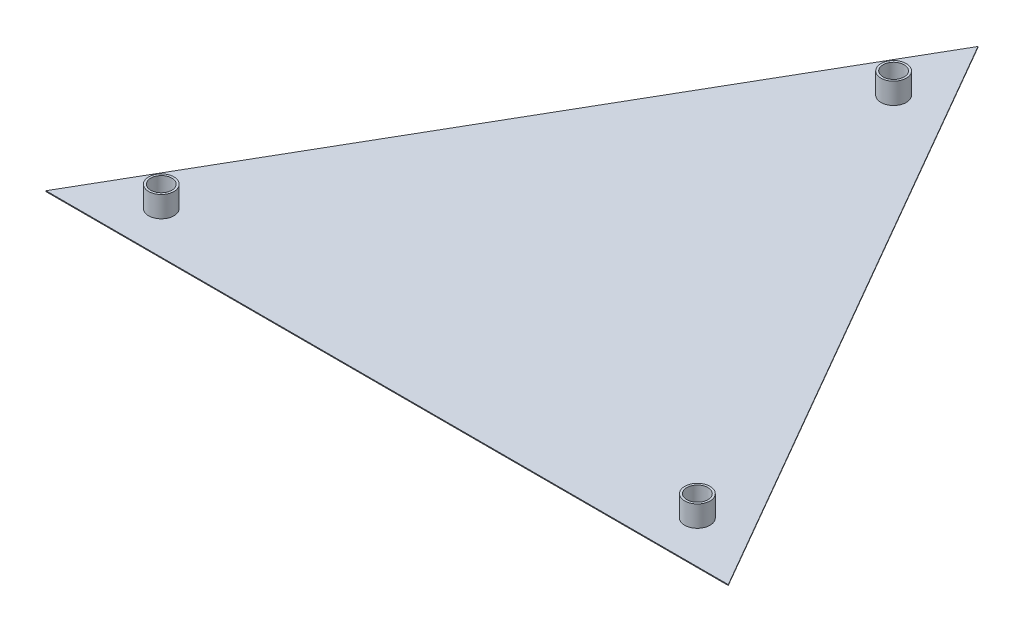
ISO-10303-21;
HEADER;
FILE_DESCRIPTION(('STEP AP214'),'2;1');
FILE_NAME('part.step','',(''),(''),'','','');
FILE_SCHEMA(('AUTOMOTIVE_DESIGN { 1 0 10303 214 1 1 1 1 }'));
ENDSEC;
DATA;
#1=APPLICATION_CONTEXT('core data for automotive mechanical design processes');
#2=APPLICATION_PROTOCOL_DEFINITION('international standard','automotive_design',2000,#1);
#3=PRODUCT_CONTEXT('',#1,'mechanical');
#4=PRODUCT('Part','Part','',(#3));
#5=PRODUCT_RELATED_PRODUCT_CATEGORY('part','',(#4));
#6=PRODUCT_DEFINITION_FORMATION('','',#4);
#7=PRODUCT_DEFINITION_CONTEXT('part definition',#1,'design');
#8=PRODUCT_DEFINITION('design','',#6,#7);
#9=PRODUCT_DEFINITION_SHAPE('','',#8);
#10=(LENGTH_UNIT() NAMED_UNIT(*) SI_UNIT(.MILLI.,.METRE.));
#11=(NAMED_UNIT(*) PLANE_ANGLE_UNIT() SI_UNIT($,.RADIAN.));
#12=(NAMED_UNIT(*) SI_UNIT($,.STERADIAN.) SOLID_ANGLE_UNIT());
#13=UNCERTAINTY_MEASURE_WITH_UNIT(LENGTH_MEASURE(1.E-05),#10,'distance_accuracy_value','');
#14=(GEOMETRIC_REPRESENTATION_CONTEXT(3) GLOBAL_UNCERTAINTY_ASSIGNED_CONTEXT((#13)) GLOBAL_UNIT_ASSIGNED_CONTEXT((#10,
#11,#12)) REPRESENTATION_CONTEXT('',''));
#15=CARTESIAN_POINT('',(0.,0.,0.));
#16=DIRECTION('',(0.,0.,1.));
#17=DIRECTION('',(1.,0.,0.));
#18=AXIS2_PLACEMENT_3D('',#15,#16,#17);
#19=CARTESIAN_POINT('',(347.27360972876,5.,-3.60923082455256));
#20=DIRECTION('',(0.,1.,0.));
#21=DIRECTION('',(0.,0.,1.));
#22=AXIS2_PLACEMENT_3D('',#19,#20,#21);
#23=PLANE('',#22);
#24=CARTESIAN_POINT('',(347.27360972876,5.,-3.60923082455256));
#25=DIRECTION('',(0.,1.,0.));
#26=DIRECTION('',(0.,0.,1.));
#27=AXIS2_PLACEMENT_3D('',#24,#25,#26);
#28=CIRCLE('',#27,2.99999999999999);
#29=CARTESIAN_POINT('',(347.27360972876,5.,-0.609230824552565));
#30=VERTEX_POINT('',#29);
#31=EDGE_CURVE('E66',#30,#30,#28,.T.);
#32=ORIENTED_EDGE('',*,*,#31,.T.);
#33=EDGE_LOOP('',(#32));
#34=FACE_BOUND('',#33,.T.);
#35=CARTESIAN_POINT('',(347.27360972876,5.,-3.60923082455256));
#36=DIRECTION('',(0.,1.,0.));
#37=DIRECTION('',(0.,0.,1.));
#38=AXIS2_PLACEMENT_3D('',#35,#36,#37);
#39=CIRCLE('',#38,2.50000000000002);
#40=CARTESIAN_POINT('',(347.27360972876,5.,-1.10923082455254));
#41=VERTEX_POINT('',#40);
#42=EDGE_CURVE('E57',#41,#41,#39,.T.);
#43=ORIENTED_EDGE('',*,*,#42,.F.);
#44=EDGE_LOOP('',(#43));
#45=FACE_BOUND('',#44,.T.);
#46=ADVANCED_FACE('F53',(#34,#45),#23,.T.);
#47=CARTESIAN_POINT('',(347.27360972876,0.,-3.60923082455256));
#48=DIRECTION('',(0.,1.,0.));
#49=DIRECTION('',(0.,0.,1.));
#50=AXIS2_PLACEMENT_3D('',#47,#48,#49);
#51=PLANE('',#50);
#52=CARTESIAN_POINT('',(347.27360972876,0.,-3.60923082455256));
#53=DIRECTION('',(0.,1.,0.));
#54=DIRECTION('',(0.,0.,1.));
#55=AXIS2_PLACEMENT_3D('',#52,#53,#54);
#56=CIRCLE('',#55,2.99999999999999);
#57=CARTESIAN_POINT('',(347.27360972876,0.,-0.609230824552565));
#58=VERTEX_POINT('',#57);
#59=EDGE_CURVE('E64',#58,#58,#56,.T.);
#60=ORIENTED_EDGE('',*,*,#59,.F.);
#61=EDGE_LOOP('',(#60));
#62=FACE_BOUND('',#61,.T.);
#63=CARTESIAN_POINT('',(347.27360972876,0.,-3.60923082455256));
#64=DIRECTION('',(0.,1.,0.));
#65=DIRECTION('',(0.,0.,1.));
#66=AXIS2_PLACEMENT_3D('',#63,#64,#65);
#67=CIRCLE('',#66,2.50000000000002);
#68=CARTESIAN_POINT('',(347.27360972876,0.,-1.10923082455254));
#69=VERTEX_POINT('',#68);
#70=EDGE_CURVE('E12',#69,#69,#67,.T.);
#71=ORIENTED_EDGE('',*,*,#70,.T.);
#72=EDGE_LOOP('',(#71));
#73=FACE_BOUND('',#72,.T.);
#74=ADVANCED_FACE('F74',(#62,#73),#51,.F.);
#75=CARTESIAN_POINT('',(347.27360972876,5.,-3.60923082455256));
#76=DIRECTION('',(0.,-1.,0.));
#77=DIRECTION('',(0.,0.,-1.));
#78=AXIS2_PLACEMENT_3D('',#75,#76,#77);
#79=CYLINDRICAL_SURFACE('',#78,2.99999999999999);
#80=ORIENTED_EDGE('',*,*,#31,.F.);
#81=EDGE_LOOP('',(#80));
#82=FACE_BOUND('',#81,.T.);
#83=ORIENTED_EDGE('',*,*,#59,.T.);
#84=EDGE_LOOP('',(#83));
#85=FACE_BOUND('',#84,.T.);
#86=ADVANCED_FACE('F72',(#82,#85),#79,.T.);
#87=CARTESIAN_POINT('',(347.27360972876,5.,-3.60923082455256));
#88=DIRECTION('',(0.,-1.,0.));
#89=DIRECTION('',(0.,0.,-1.));
#90=AXIS2_PLACEMENT_3D('',#87,#88,#89);
#91=CYLINDRICAL_SURFACE('',#90,2.50000000000002);
#92=ORIENTED_EDGE('',*,*,#42,.T.);
#93=EDGE_LOOP('',(#92));
#94=FACE_BOUND('',#93,.T.);
#95=ORIENTED_EDGE('',*,*,#70,.F.);
#96=EDGE_LOOP('',(#95));
#97=FACE_BOUND('',#96,.T.);
#98=ADVANCED_FACE('F55',(#94,#97),#91,.F.);
#99=CLOSED_SHELL('',(#46,#74,#86,#98));
#100=MANIFOLD_SOLID_BREP('B2',#99);
#101=CARTESIAN_POINT('',(410.793152562545,5.,106.417182486529));
#102=DIRECTION('',(0.,1.,0.));
#103=DIRECTION('',(0.,0.,1.));
#104=AXIS2_PLACEMENT_3D('',#101,#102,#103);
#105=PLANE('',#104);
#106=CARTESIAN_POINT('',(410.793152562545,5.,106.417182486529));
#107=DIRECTION('',(0.,1.,0.));
#108=DIRECTION('',(0.,0.,1.));
#109=AXIS2_PLACEMENT_3D('',#106,#107,#108);
#110=CIRCLE('',#109,2.99999999999999);
#111=CARTESIAN_POINT('',(410.793152562545,5.,109.417182486529));
#112=VERTEX_POINT('',#111);
#113=EDGE_CURVE('E135',#112,#112,#110,.T.);
#114=ORIENTED_EDGE('',*,*,#113,.T.);
#115=EDGE_LOOP('',(#114));
#116=FACE_BOUND('',#115,.T.);
#117=CARTESIAN_POINT('',(410.793152562545,5.,106.417182486529));
#118=DIRECTION('',(0.,1.,0.));
#119=DIRECTION('',(0.,0.,1.));
#120=AXIS2_PLACEMENT_3D('',#117,#118,#119);
#121=CIRCLE('',#120,2.50000000000002);
#122=CARTESIAN_POINT('',(410.793152562545,5.,108.917182486529));
#123=VERTEX_POINT('',#122);
#124=EDGE_CURVE('E126',#123,#123,#121,.T.);
#125=ORIENTED_EDGE('',*,*,#124,.F.);
#126=EDGE_LOOP('',(#125));
#127=FACE_BOUND('',#126,.T.);
#128=ADVANCED_FACE('F122',(#116,#127),#105,.T.);
#129=CARTESIAN_POINT('',(410.793152562545,0.,106.417182486529));
#130=DIRECTION('',(0.,1.,0.));
#131=DIRECTION('',(0.,0.,1.));
#132=AXIS2_PLACEMENT_3D('',#129,#130,#131);
#133=PLANE('',#132);
#134=CARTESIAN_POINT('',(410.793152562545,0.,106.417182486529));
#135=DIRECTION('',(0.,1.,0.));
#136=DIRECTION('',(0.,0.,1.));
#137=AXIS2_PLACEMENT_3D('',#134,#135,#136);
#138=CIRCLE('',#137,2.99999999999999);
#139=CARTESIAN_POINT('',(410.793152562545,0.,109.417182486529));
#140=VERTEX_POINT('',#139);
#141=EDGE_CURVE('E133',#140,#140,#138,.T.);
#142=ORIENTED_EDGE('',*,*,#141,.F.);
#143=EDGE_LOOP('',(#142));
#144=FACE_BOUND('',#143,.T.);
#145=CARTESIAN_POINT('',(410.793152562545,0.,106.417182486529));
#146=DIRECTION('',(0.,1.,0.));
#147=DIRECTION('',(0.,0.,1.));
#148=AXIS2_PLACEMENT_3D('',#145,#146,#147);
#149=CIRCLE('',#148,2.50000000000002);
#150=CARTESIAN_POINT('',(410.793152562545,0.,108.917182486529));
#151=VERTEX_POINT('',#150);
#152=EDGE_CURVE('E52',#151,#151,#149,.T.);
#153=ORIENTED_EDGE('',*,*,#152,.T.);
#154=EDGE_LOOP('',(#153));
#155=FACE_BOUND('',#154,.T.);
#156=ADVANCED_FACE('F143',(#144,#155),#133,.F.);
#157=CARTESIAN_POINT('',(410.793152562545,5.,106.417182486529));
#158=DIRECTION('',(0.,-1.,0.));
#159=DIRECTION('',(0.,0.,-1.));
#160=AXIS2_PLACEMENT_3D('',#157,#158,#159);
#161=CYLINDRICAL_SURFACE('',#160,2.99999999999999);
#162=ORIENTED_EDGE('',*,*,#113,.F.);
#163=EDGE_LOOP('',(#162));
#164=FACE_BOUND('',#163,.T.);
#165=ORIENTED_EDGE('',*,*,#141,.T.);
#166=EDGE_LOOP('',(#165));
#167=FACE_BOUND('',#166,.T.);
#168=ADVANCED_FACE('F141',(#164,#167),#161,.T.);
#169=CARTESIAN_POINT('',(410.793152562545,5.,106.417182486529));
#170=DIRECTION('',(0.,-1.,0.));
#171=DIRECTION('',(0.,0.,-1.));
#172=AXIS2_PLACEMENT_3D('',#169,#170,#171);
#173=CYLINDRICAL_SURFACE('',#172,2.50000000000002);
#174=ORIENTED_EDGE('',*,*,#124,.T.);
#175=EDGE_LOOP('',(#174));
#176=FACE_BOUND('',#175,.T.);
#177=ORIENTED_EDGE('',*,*,#152,.F.);
#178=EDGE_LOOP('',(#177));
#179=FACE_BOUND('',#178,.T.);
#180=ADVANCED_FACE('F124',(#176,#179),#173,.F.);
#181=CLOSED_SHELL('',(#128,#156,#168,#180));
#182=MANIFOLD_SOLID_BREP('B7',#181);
#183=CARTESIAN_POINT('',(283.758521159064,5.,106.426112565137));
#184=DIRECTION('',(0.,-1.,0.));
#185=DIRECTION('',(0.,0.,-1.));
#186=AXIS2_PLACEMENT_3D('',#183,#184,#185);
#187=CYLINDRICAL_SURFACE('',#186,2.50000000000002);
#188=CARTESIAN_POINT('',(283.758521159064,5.,106.426112565137));
#189=DIRECTION('',(0.,1.,0.));
#190=DIRECTION('',(0.,0.,1.));
#191=AXIS2_PLACEMENT_3D('',#188,#189,#190);
#192=CIRCLE('',#191,2.50000000000002);
#193=CARTESIAN_POINT('',(283.758521159064,5.,108.926112565137));
#194=VERTEX_POINT('',#193);
#195=EDGE_CURVE('E199',#194,#194,#192,.T.);
#196=ORIENTED_EDGE('',*,*,#195,.T.);
#197=EDGE_LOOP('',(#196));
#198=FACE_BOUND('',#197,.T.);
#199=CARTESIAN_POINT('',(283.758521159064,0.,106.426112565137));
#200=DIRECTION('',(0.,1.,0.));
#201=DIRECTION('',(0.,0.,1.));
#202=AXIS2_PLACEMENT_3D('',#199,#200,#201);
#203=CIRCLE('',#202,2.50000000000002);
#204=CARTESIAN_POINT('',(283.758521159064,0.,108.926112565137));
#205=VERTEX_POINT('',#204);
#206=EDGE_CURVE('E205',#205,#205,#203,.T.);
#207=ORIENTED_EDGE('',*,*,#206,.F.);
#208=EDGE_LOOP('',(#207));
#209=FACE_BOUND('',#208,.T.);
#210=ADVANCED_FACE('F192',(#198,#209),#187,.F.);
#211=CARTESIAN_POINT('',(283.758521159064,5.,106.426112565137));
#212=DIRECTION('',(0.,-1.,0.));
#213=DIRECTION('',(0.,0.,-1.));
#214=AXIS2_PLACEMENT_3D('',#211,#212,#213);
#215=CYLINDRICAL_SURFACE('',#214,2.99999999999999);
#216=CARTESIAN_POINT('',(283.758521159064,5.,106.426112565137));
#217=DIRECTION('',(0.,1.,0.));
#218=DIRECTION('',(0.,0.,1.));
#219=AXIS2_PLACEMENT_3D('',#216,#217,#218);
#220=CIRCLE('',#219,2.99999999999999);
#221=CARTESIAN_POINT('',(283.758521159064,5.,109.426112565137));
#222=VERTEX_POINT('',#221);
#223=EDGE_CURVE('E121',#222,#222,#220,.T.);
#224=ORIENTED_EDGE('',*,*,#223,.F.);
#225=EDGE_LOOP('',(#224));
#226=FACE_BOUND('',#225,.T.);
#227=CARTESIAN_POINT('',(283.758521159064,0.,106.426112565137));
#228=DIRECTION('',(0.,1.,0.));
#229=DIRECTION('',(0.,0.,1.));
#230=AXIS2_PLACEMENT_3D('',#227,#228,#229);
#231=CIRCLE('',#230,2.99999999999999);
#232=CARTESIAN_POINT('',(283.758521159064,0.,109.426112565137));
#233=VERTEX_POINT('',#232);
#234=EDGE_CURVE('E195',#233,#233,#231,.T.);
#235=ORIENTED_EDGE('',*,*,#234,.T.);
#236=EDGE_LOOP('',(#235));
#237=FACE_BOUND('',#236,.T.);
#238=ADVANCED_FACE('F212',(#226,#237),#215,.T.);
#239=CARTESIAN_POINT('',(0.,5.,0.));
#240=DIRECTION('',(0.,1.,0.));
#241=DIRECTION('',(0.,0.,1.));
#242=AXIS2_PLACEMENT_3D('',#239,#240,#241);
#243=PLANE('',#242);
#244=ORIENTED_EDGE('',*,*,#195,.F.);
#245=EDGE_LOOP('',(#244));
#246=FACE_BOUND('',#245,.T.);
#247=ORIENTED_EDGE('',*,*,#223,.T.);
#248=EDGE_LOOP('',(#247));
#249=FACE_BOUND('',#248,.T.);
#250=ADVANCED_FACE('F216',(#246,#249),#243,.T.);
#251=CARTESIAN_POINT('',(0.,0.,0.));
#252=DIRECTION('',(0.,1.,0.));
#253=DIRECTION('',(0.,0.,1.));
#254=AXIS2_PLACEMENT_3D('',#251,#252,#253);
#255=PLANE('',#254);
#256=ORIENTED_EDGE('',*,*,#206,.T.);
#257=EDGE_LOOP('',(#256));
#258=FACE_BOUND('',#257,.T.);
#259=ORIENTED_EDGE('',*,*,#234,.F.);
#260=EDGE_LOOP('',(#259));
#261=FACE_BOUND('',#260,.T.);
#262=ADVANCED_FACE('F214',(#258,#261),#255,.F.);
#263=CLOSED_SHELL('',(#210,#238,#250,#262));
#264=MANIFOLD_SOLID_BREP('B47',#263);
#265=CARTESIAN_POINT('',(250.258955329302,-0.2,144.458416065656));
#266=DIRECTION('',(0.866068346977982,0.,0.499925612829375));
#267=DIRECTION('',(0.499925612829375,0.,-0.866068346977982));
#268=AXIS2_PLACEMENT_3D('',#265,#266,#267);
#269=PLANE('',#268);
#270=DIRECTION('',(0.499925612829375,0.,-0.866068346977982));
#271=VECTOR('',#270,1.);
#272=CARTESIAN_POINT('',(250.258955329302,0.,144.458416065656));
#273=LINE('',#272,#271);
#274=CARTESIAN_POINT('',(266.439108268201,0.,116.42800924106));
#275=VERTEX_POINT('',#274);
#276=CARTESIAN_POINT('',(347.27360972876,0.,-23.6092308245526));
#277=VERTEX_POINT('',#276);
#278=EDGE_CURVE('E317',#275,#277,#273,.T.);
#279=ORIENTED_EDGE('',*,*,#278,.T.);
#280=DIRECTION('',(0.,1.,0.));
#281=VECTOR('',#280,1.);
#282=CARTESIAN_POINT('',(347.27360972876,-0.2,-23.6092308245526));
#283=LINE('',#282,#281);
#284=CARTESIAN_POINT('',(347.27360972876,-0.2,-23.6092308245526));
#285=VERTEX_POINT('',#284);
#286=EDGE_CURVE('E190',#285,#277,#283,.T.);
#287=ORIENTED_EDGE('',*,*,#286,.F.);
#288=DIRECTION('',(0.499925612829375,0.,-0.866068346977982));
#289=VECTOR('',#288,1.);
#290=CARTESIAN_POINT('',(250.258955329302,-0.2,144.458416065656));
#291=LINE('',#290,#289);
#292=CARTESIAN_POINT('',(266.439108268201,-0.2,116.42800924106));
#293=VERTEX_POINT('',#292);
#294=EDGE_CURVE('E299',#293,#285,#291,.T.);
#295=ORIENTED_EDGE('',*,*,#294,.F.);
#296=DIRECTION('',(0.,1.,0.));
#297=VECTOR('',#296,1.);
#298=CARTESIAN_POINT('',(266.439108268201,-0.2,116.42800924106));
#299=LINE('',#298,#297);
#300=EDGE_CURVE('E257',#293,#275,#299,.T.);
#301=ORIENTED_EDGE('',*,*,#300,.T.);
#302=EDGE_LOOP('',(#279,#287,#295,#301));
#303=FACE_BOUND('',#302,.T.);
#304=ADVANCED_FACE('F253',(#303),#269,.F.);
#305=CARTESIAN_POINT('',(270.684828790068,-0.2,-156.271808922297));
#306=DIRECTION('',(-0.866036694302782,0.,0.499980443738663));
#307=DIRECTION('',(0.499980443738663,0.,0.866036694302782));
#308=AXIS2_PLACEMENT_3D('',#305,#306,#307);
#309=PLANE('',#308);
#310=DIRECTION('',(0.499980443738663,0.,0.866036694302782));
#311=VECTOR('',#310,1.);
#312=CARTESIAN_POINT('',(270.684828790068,0.,-156.271808922297));
#313=LINE('',#312,#311);
#314=CARTESIAN_POINT('',(428.113670918371,0.,116.417164680787));
#315=VERTEX_POINT('',#314);
#316=EDGE_CURVE('E289',#277,#315,#313,.T.);
#317=ORIENTED_EDGE('',*,*,#316,.T.);
#318=DIRECTION('',(0.,1.,0.));
#319=VECTOR('',#318,1.);
#320=CARTESIAN_POINT('',(428.113670918371,-0.2,116.417164680787));
#321=LINE('',#320,#319);
#322=CARTESIAN_POINT('',(428.113670918371,-0.2,116.417164680787));
#323=VERTEX_POINT('',#322);
#324=EDGE_CURVE('E263',#323,#315,#321,.T.);
#325=ORIENTED_EDGE('',*,*,#324,.F.);
#326=DIRECTION('',(0.499980443738663,0.,0.866036694302782));
#327=VECTOR('',#326,1.);
#328=CARTESIAN_POINT('',(270.684828790068,-0.2,-156.271808922297));
#329=LINE('',#328,#327);
#330=EDGE_CURVE('E271',#285,#323,#329,.T.);
#331=ORIENTED_EDGE('',*,*,#330,.F.);
#332=ORIENTED_EDGE('',*,*,#286,.T.);
#333=EDGE_LOOP('',(#317,#325,#331,#332));
#334=FACE_BOUND('',#333,.T.);
#335=ADVANCED_FACE('F336',(#334),#309,.F.);
#336=CARTESIAN_POINT('',(347.27360972876,-0.2,-3.60923082455256));
#337=DIRECTION('',(0.,1.,0.));
#338=DIRECTION('',(0.,0.,1.));
#339=AXIS2_PLACEMENT_3D('',#336,#337,#338);
#340=CYLINDRICAL_SURFACE('',#339,2.99999999999999);
#341=CARTESIAN_POINT('',(347.27360972876,-0.2,-3.60923082455256));
#342=DIRECTION('',(0.,1.,0.));
#343=DIRECTION('',(0.,0.,1.));
#344=AXIS2_PLACEMENT_3D('',#341,#342,#343);
#345=CIRCLE('',#344,2.99999999999999);
#346=CARTESIAN_POINT('',(347.27360972876,-0.2,-0.609230824552565));
#347=VERTEX_POINT('',#346);
#348=EDGE_CURVE('E301',#347,#347,#345,.T.);
#349=ORIENTED_EDGE('',*,*,#348,.F.);
#350=EDGE_LOOP('',(#349));
#351=FACE_BOUND('',#350,.T.);
#352=CARTESIAN_POINT('',(347.27360972876,0.,-3.60923082455256));
#353=DIRECTION('',(0.,1.,0.));
#354=DIRECTION('',(0.,0.,1.));
#355=AXIS2_PLACEMENT_3D('',#352,#353,#354);
#356=CIRCLE('',#355,2.99999999999999);
#357=CARTESIAN_POINT('',(347.27360972876,0.,-0.609230824552565));
#358=VERTEX_POINT('',#357);
#359=EDGE_CURVE('E314',#358,#358,#356,.T.);
#360=ORIENTED_EDGE('',*,*,#359,.T.);
#361=EDGE_LOOP('',(#360));
#362=FACE_BOUND('',#361,.T.);
#363=ADVANCED_FACE('F332',(#351,#362),#340,.F.);
#364=CARTESIAN_POINT('',(410.793152562545,-0.2,106.417182486529));
#365=DIRECTION('',(0.,1.,0.));
#366=DIRECTION('',(0.,0.,1.));
#367=AXIS2_PLACEMENT_3D('',#364,#365,#366);
#368=CYLINDRICAL_SURFACE('',#367,2.99999999999999);
#369=CARTESIAN_POINT('',(410.793152562545,-0.2,106.417182486529));
#370=DIRECTION('',(0.,1.,0.));
#371=DIRECTION('',(0.,0.,1.));
#372=AXIS2_PLACEMENT_3D('',#369,#370,#371);
#373=CIRCLE('',#372,2.99999999999999);
#374=CARTESIAN_POINT('',(410.793152562545,-0.2,109.417182486529));
#375=VERTEX_POINT('',#374);
#376=EDGE_CURVE('E322',#375,#375,#373,.T.);
#377=ORIENTED_EDGE('',*,*,#376,.F.);
#378=EDGE_LOOP('',(#377));
#379=FACE_BOUND('',#378,.T.);
#380=CARTESIAN_POINT('',(410.793152562545,0.,106.417182486529));
#381=DIRECTION('',(0.,1.,0.));
#382=DIRECTION('',(0.,0.,1.));
#383=AXIS2_PLACEMENT_3D('',#380,#381,#382);
#384=CIRCLE('',#383,2.99999999999999);
#385=CARTESIAN_POINT('',(410.793152562545,0.,109.417182486529));
#386=VERTEX_POINT('',#385);
#387=EDGE_CURVE('E311',#386,#386,#384,.T.);
#388=ORIENTED_EDGE('',*,*,#387,.T.);
#389=EDGE_LOOP('',(#388));
#390=FACE_BOUND('',#389,.T.);
#391=ADVANCED_FACE('F335',(#379,#390),#368,.F.);
#392=CARTESIAN_POINT('',(283.758521159064,-0.2,106.426112565137));
#393=DIRECTION('',(0.,1.,0.));
#394=DIRECTION('',(0.,0.,1.));
#395=AXIS2_PLACEMENT_3D('',#392,#393,#394);
#396=CYLINDRICAL_SURFACE('',#395,2.99999999999999);
#397=CARTESIAN_POINT('',(283.758521159064,-0.2,106.426112565137));
#398=DIRECTION('',(0.,1.,0.));
#399=DIRECTION('',(0.,0.,1.));
#400=AXIS2_PLACEMENT_3D('',#397,#398,#399);
#401=CIRCLE('',#400,2.99999999999999);
#402=CARTESIAN_POINT('',(283.758521159064,-0.2,109.426112565137));
#403=VERTEX_POINT('',#402);
#404=EDGE_CURVE('E320',#403,#403,#401,.T.);
#405=ORIENTED_EDGE('',*,*,#404,.F.);
#406=EDGE_LOOP('',(#405));
#407=FACE_BOUND('',#406,.T.);
#408=CARTESIAN_POINT('',(283.758521159064,0.,106.426112565137));
#409=DIRECTION('',(0.,1.,0.));
#410=DIRECTION('',(0.,0.,1.));
#411=AXIS2_PLACEMENT_3D('',#408,#409,#410);
#412=CIRCLE('',#411,2.99999999999999);
#413=CARTESIAN_POINT('',(283.758521159064,0.,109.426112565137));
#414=VERTEX_POINT('',#413);
#415=EDGE_CURVE('E308',#414,#414,#412,.T.);
#416=ORIENTED_EDGE('',*,*,#415,.T.);
#417=EDGE_LOOP('',(#416));
#418=FACE_BOUND('',#417,.T.);
#419=ADVANCED_FACE('F255',(#407,#418),#396,.F.);
#420=CARTESIAN_POINT('',(0.00781077956215997,-0.2,116.445880514169));
#421=DIRECTION('',(6.70764780179426E-05,0.,0.999999997750373));
#422=DIRECTION('',(0.999999997750373,0.,-6.70764780179426E-05));
#423=AXIS2_PLACEMENT_3D('',#420,#421,#422);
#424=PLANE('',#423);
#425=DIRECTION('',(0.999999997750373,0.,-6.70764780179426E-05));
#426=VECTOR('',#425,1.);
#427=CARTESIAN_POINT('',(0.00781077956215997,0.,116.445880514169));
#428=LINE('',#427,#426);
#429=EDGE_CURVE('E295',#275,#315,#428,.T.);
#430=ORIENTED_EDGE('',*,*,#429,.F.);
#431=ORIENTED_EDGE('',*,*,#300,.F.);
#432=DIRECTION('',(0.999999997750373,0.,-6.70764780179426E-05));
#433=VECTOR('',#432,1.);
#434=CARTESIAN_POINT('',(0.00781077956215997,-0.2,116.445880514169));
#435=LINE('',#434,#433);
#436=EDGE_CURVE('E294',#293,#323,#435,.T.);
#437=ORIENTED_EDGE('',*,*,#436,.T.);
#438=ORIENTED_EDGE('',*,*,#324,.T.);
#439=EDGE_LOOP('',(#430,#431,#437,#438));
#440=FACE_BOUND('',#439,.T.);
#441=ADVANCED_FACE('F292',(#440),#424,.T.);
#442=CARTESIAN_POINT('',(0.,-0.2,0.));
#443=DIRECTION('',(0.,1.,0.));
#444=DIRECTION('',(0.,0.,1.));
#445=AXIS2_PLACEMENT_3D('',#442,#443,#444);
#446=PLANE('',#445);
#447=ORIENTED_EDGE('',*,*,#404,.T.);
#448=EDGE_LOOP('',(#447));
#449=FACE_BOUND('',#448,.T.);
#450=ORIENTED_EDGE('',*,*,#376,.T.);
#451=EDGE_LOOP('',(#450));
#452=FACE_BOUND('',#451,.T.);
#453=ORIENTED_EDGE('',*,*,#348,.T.);
#454=EDGE_LOOP('',(#453));
#455=FACE_BOUND('',#454,.T.);
#456=ORIENTED_EDGE('',*,*,#294,.T.);
#457=ORIENTED_EDGE('',*,*,#330,.T.);
#458=ORIENTED_EDGE('',*,*,#436,.F.);
#459=EDGE_LOOP('',(#456,#457,#458));
#460=FACE_BOUND('',#459,.T.);
#461=ADVANCED_FACE('F303',(#449,#452,#455,#460),#446,.F.);
#462=CARTESIAN_POINT('',(0.,0.,0.));
#463=DIRECTION('',(0.,1.,0.));
#464=DIRECTION('',(0.,0.,1.));
#465=AXIS2_PLACEMENT_3D('',#462,#463,#464);
#466=PLANE('',#465);
#467=ORIENTED_EDGE('',*,*,#415,.F.);
#468=EDGE_LOOP('',(#467));
#469=FACE_BOUND('',#468,.T.);
#470=ORIENTED_EDGE('',*,*,#387,.F.);
#471=EDGE_LOOP('',(#470));
#472=FACE_BOUND('',#471,.T.);
#473=ORIENTED_EDGE('',*,*,#359,.F.);
#474=EDGE_LOOP('',(#473));
#475=FACE_BOUND('',#474,.T.);
#476=ORIENTED_EDGE('',*,*,#278,.F.);
#477=ORIENTED_EDGE('',*,*,#429,.T.);
#478=ORIENTED_EDGE('',*,*,#316,.F.);
#479=EDGE_LOOP('',(#476,#477,#478));
#480=FACE_BOUND('',#479,.T.);
#481=ADVANCED_FACE('F340',(#469,#472,#475,#480),#466,.T.);
#482=CLOSED_SHELL('',(#304,#335,#363,#391,#419,#441,#461,#481));
#483=MANIFOLD_SOLID_BREP('B116',#482);
#484=ADVANCED_BREP_SHAPE_REPRESENTATION('',(#18,#100,#182,#264,#483),#14);
#485=SHAPE_DEFINITION_REPRESENTATION(#9,#484);
ENDSEC;
END-ISO-10303-21;
